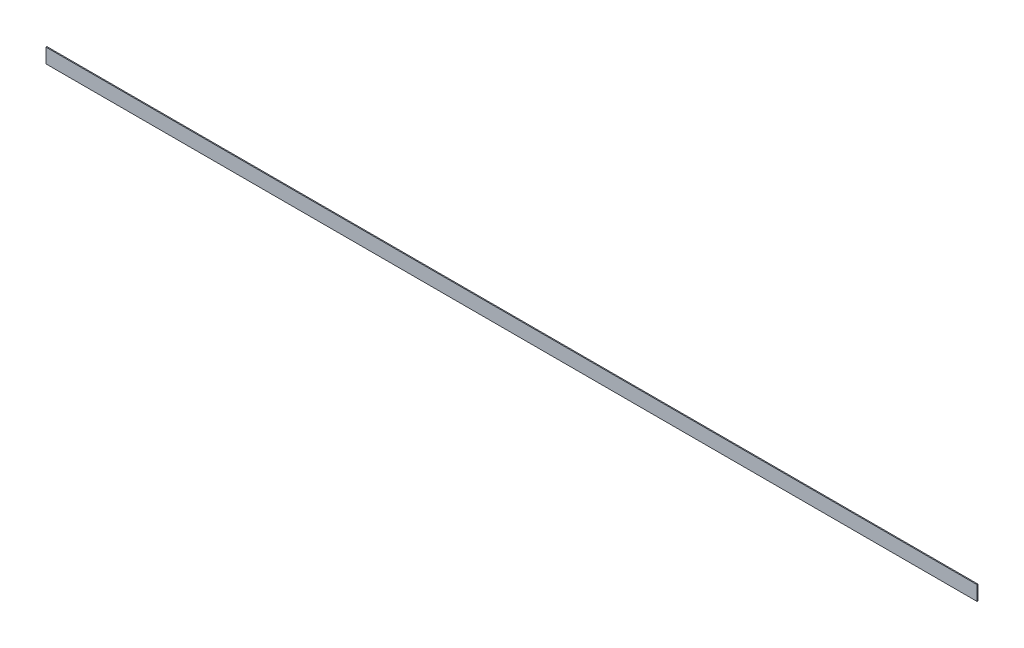
ISO-10303-21;
HEADER;
FILE_DESCRIPTION(('STEP AP214'),'2;1');
FILE_NAME('part.step','',(''),(''),'','','');
FILE_SCHEMA(('AUTOMOTIVE_DESIGN { 1 0 10303 214 1 1 1 1 }'));
ENDSEC;
DATA;
#1=APPLICATION_CONTEXT('core data for automotive mechanical design processes');
#2=APPLICATION_PROTOCOL_DEFINITION('international standard','automotive_design',2000,#1);
#3=PRODUCT_CONTEXT('',#1,'mechanical');
#4=PRODUCT('Part','Part','',(#3));
#5=PRODUCT_RELATED_PRODUCT_CATEGORY('part','',(#4));
#6=PRODUCT_DEFINITION_FORMATION('','',#4);
#7=PRODUCT_DEFINITION_CONTEXT('part definition',#1,'design');
#8=PRODUCT_DEFINITION('design','',#6,#7);
#9=PRODUCT_DEFINITION_SHAPE('','',#8);
#10=(LENGTH_UNIT() NAMED_UNIT(*) SI_UNIT(.MILLI.,.METRE.));
#11=(NAMED_UNIT(*) PLANE_ANGLE_UNIT() SI_UNIT($,.RADIAN.));
#12=(NAMED_UNIT(*) SI_UNIT($,.STERADIAN.) SOLID_ANGLE_UNIT());
#13=UNCERTAINTY_MEASURE_WITH_UNIT(LENGTH_MEASURE(1.E-05),#10,'distance_accuracy_value','');
#14=(GEOMETRIC_REPRESENTATION_CONTEXT(3) GLOBAL_UNCERTAINTY_ASSIGNED_CONTEXT((#13)) GLOBAL_UNIT_ASSIGNED_CONTEXT((#10,
#11,#12)) REPRESENTATION_CONTEXT('',''));
#15=CARTESIAN_POINT('',(0.,0.,0.));
#16=DIRECTION('',(0.,0.,1.));
#17=DIRECTION('',(1.,0.,0.));
#18=AXIS2_PLACEMENT_3D('',#15,#16,#17);
#19=CARTESIAN_POINT('',(0.,0.,1.27));
#20=DIRECTION('',(1.,0.,0.));
#21=DIRECTION('',(0.,0.,-1.));
#22=AXIS2_PLACEMENT_3D('',#19,#20,#21);
#23=PLANE('',#22);
#24=DIRECTION('',(0.,-1.,0.));
#25=VECTOR('',#24,1.);
#26=CARTESIAN_POINT('',(0.,0.,0.));
#27=LINE('',#26,#25);
#28=CARTESIAN_POINT('',(0.,19.05,0.));
#29=VERTEX_POINT('',#28);
#30=CARTESIAN_POINT('',(0.,0.,0.));
#31=VERTEX_POINT('',#30);
#32=EDGE_CURVE('E97',#29,#31,#27,.T.);
#33=ORIENTED_EDGE('',*,*,#32,.T.);
#34=DIRECTION('',(0.,0.,-1.));
#35=VECTOR('',#34,1.);
#36=CARTESIAN_POINT('',(0.,0.,1.27));
#37=LINE('',#36,#35);
#38=CARTESIAN_POINT('',(0.,0.,1.27));
#39=VERTEX_POINT('',#38);
#40=EDGE_CURVE('E11',#39,#31,#37,.T.);
#41=ORIENTED_EDGE('',*,*,#40,.F.);
#42=DIRECTION('',(0.,-1.,0.));
#43=VECTOR('',#42,1.);
#44=CARTESIAN_POINT('',(0.,0.,1.27));
#45=LINE('',#44,#43);
#46=CARTESIAN_POINT('',(0.,19.05,1.27));
#47=VERTEX_POINT('',#46);
#48=EDGE_CURVE('E85',#47,#39,#45,.T.);
#49=ORIENTED_EDGE('',*,*,#48,.F.);
#50=DIRECTION('',(0.,0.,-1.));
#51=VECTOR('',#50,1.);
#52=CARTESIAN_POINT('',(0.,19.05,1.27));
#53=LINE('',#52,#51);
#54=EDGE_CURVE('E93',#47,#29,#53,.T.);
#55=ORIENTED_EDGE('',*,*,#54,.T.);
#56=EDGE_LOOP('',(#33,#41,#49,#55));
#57=FACE_BOUND('',#56,.T.);
#58=ADVANCED_FACE('F34',(#57),#23,.F.);
#59=CARTESIAN_POINT('',(0.,0.,1.27));
#60=DIRECTION('',(0.,1.,0.));
#61=DIRECTION('',(0.,0.,1.));
#62=AXIS2_PLACEMENT_3D('',#59,#60,#61);
#63=PLANE('',#62);
#64=DIRECTION('',(1.,0.,0.));
#65=VECTOR('',#64,1.);
#66=CARTESIAN_POINT('',(0.,0.,0.));
#67=LINE('',#66,#65);
#68=CARTESIAN_POINT('',(1219.2,0.,0.));
#69=VERTEX_POINT('',#68);
#70=EDGE_CURVE('E89',#31,#69,#67,.T.);
#71=ORIENTED_EDGE('',*,*,#70,.T.);
#72=DIRECTION('',(0.,0.,-1.));
#73=VECTOR('',#72,1.);
#74=CARTESIAN_POINT('',(1219.2,0.,1.27));
#75=LINE('',#74,#73);
#76=CARTESIAN_POINT('',(1219.2,0.,1.27));
#77=VERTEX_POINT('',#76);
#78=EDGE_CURVE('E42',#77,#69,#75,.T.);
#79=ORIENTED_EDGE('',*,*,#78,.F.);
#80=DIRECTION('',(1.,0.,0.));
#81=VECTOR('',#80,1.);
#82=CARTESIAN_POINT('',(0.,0.,1.27));
#83=LINE('',#82,#81);
#84=EDGE_CURVE('E80',#39,#77,#83,.T.);
#85=ORIENTED_EDGE('',*,*,#84,.F.);
#86=ORIENTED_EDGE('',*,*,#40,.T.);
#87=EDGE_LOOP('',(#71,#79,#85,#86));
#88=FACE_BOUND('',#87,.T.);
#89=ADVANCED_FACE('F88',(#88),#63,.F.);
#90=CARTESIAN_POINT('',(1219.2,0.,1.27));
#91=DIRECTION('',(-1.,0.,0.));
#92=DIRECTION('',(0.,0.,1.));
#93=AXIS2_PLACEMENT_3D('',#90,#91,#92);
#94=PLANE('',#93);
#95=DIRECTION('',(0.,1.,0.));
#96=VECTOR('',#95,1.);
#97=CARTESIAN_POINT('',(1219.2,0.,0.));
#98=LINE('',#97,#96);
#99=CARTESIAN_POINT('',(1219.2,19.05,0.));
#100=VERTEX_POINT('',#99);
#101=EDGE_CURVE('E67',#69,#100,#98,.T.);
#102=ORIENTED_EDGE('',*,*,#101,.T.);
#103=DIRECTION('',(0.,0.,-1.));
#104=VECTOR('',#103,1.);
#105=CARTESIAN_POINT('',(1219.2,19.05,1.27));
#106=LINE('',#105,#104);
#107=CARTESIAN_POINT('',(1219.2,19.05,1.27));
#108=VERTEX_POINT('',#107);
#109=EDGE_CURVE('E90',#108,#100,#106,.T.);
#110=ORIENTED_EDGE('',*,*,#109,.F.);
#111=DIRECTION('',(0.,1.,0.));
#112=VECTOR('',#111,1.);
#113=CARTESIAN_POINT('',(1219.2,0.,1.27));
#114=LINE('',#113,#112);
#115=EDGE_CURVE('E83',#77,#108,#114,.T.);
#116=ORIENTED_EDGE('',*,*,#115,.F.);
#117=ORIENTED_EDGE('',*,*,#78,.T.);
#118=EDGE_LOOP('',(#102,#110,#116,#117));
#119=FACE_BOUND('',#118,.T.);
#120=ADVANCED_FACE('F91',(#119),#94,.F.);
#121=CARTESIAN_POINT('',(0.,19.05,1.27));
#122=DIRECTION('',(0.,-1.,0.));
#123=DIRECTION('',(0.,0.,-1.));
#124=AXIS2_PLACEMENT_3D('',#121,#122,#123);
#125=PLANE('',#124);
#126=DIRECTION('',(-1.,0.,0.));
#127=VECTOR('',#126,1.);
#128=CARTESIAN_POINT('',(0.,19.05,0.));
#129=LINE('',#128,#127);
#130=EDGE_CURVE('E73',#100,#29,#129,.T.);
#131=ORIENTED_EDGE('',*,*,#130,.T.);
#132=ORIENTED_EDGE('',*,*,#54,.F.);
#133=DIRECTION('',(-1.,0.,0.));
#134=VECTOR('',#133,1.);
#135=CARTESIAN_POINT('',(0.,19.05,1.27));
#136=LINE('',#135,#134);
#137=EDGE_CURVE('E50',#108,#47,#136,.T.);
#138=ORIENTED_EDGE('',*,*,#137,.F.);
#139=ORIENTED_EDGE('',*,*,#109,.T.);
#140=EDGE_LOOP('',(#131,#132,#138,#139));
#141=FACE_BOUND('',#140,.T.);
#142=ADVANCED_FACE('F104',(#141),#125,.F.);
#143=CARTESIAN_POINT('',(0.,0.,1.27));
#144=DIRECTION('',(0.,0.,-1.));
#145=DIRECTION('',(-1.,0.,0.));
#146=AXIS2_PLACEMENT_3D('',#143,#144,#145);
#147=PLANE('',#146);
#148=ORIENTED_EDGE('',*,*,#48,.T.);
#149=ORIENTED_EDGE('',*,*,#84,.T.);
#150=ORIENTED_EDGE('',*,*,#115,.T.);
#151=ORIENTED_EDGE('',*,*,#137,.T.);
#152=EDGE_LOOP('',(#148,#149,#150,#151));
#153=FACE_BOUND('',#152,.T.);
#154=ADVANCED_FACE('F81',(#153),#147,.F.);
#155=CARTESIAN_POINT('',(0.,0.,0.));
#156=DIRECTION('',(0.,0.,-1.));
#157=DIRECTION('',(-1.,0.,0.));
#158=AXIS2_PLACEMENT_3D('',#155,#156,#157);
#159=PLANE('',#158);
#160=ORIENTED_EDGE('',*,*,#32,.F.);
#161=ORIENTED_EDGE('',*,*,#130,.F.);
#162=ORIENTED_EDGE('',*,*,#101,.F.);
#163=ORIENTED_EDGE('',*,*,#70,.F.);
#164=EDGE_LOOP('',(#160,#161,#162,#163));
#165=FACE_BOUND('',#164,.T.);
#166=ADVANCED_FACE('F107',(#165),#159,.T.);
#167=CLOSED_SHELL('',(#58,#89,#120,#142,#154,#166));
#168=MANIFOLD_SOLID_BREP('B2',#167);
#169=ADVANCED_BREP_SHAPE_REPRESENTATION('',(#18,#168),#14);
#170=SHAPE_DEFINITION_REPRESENTATION(#9,#169);
ENDSEC;
END-ISO-10303-21;
